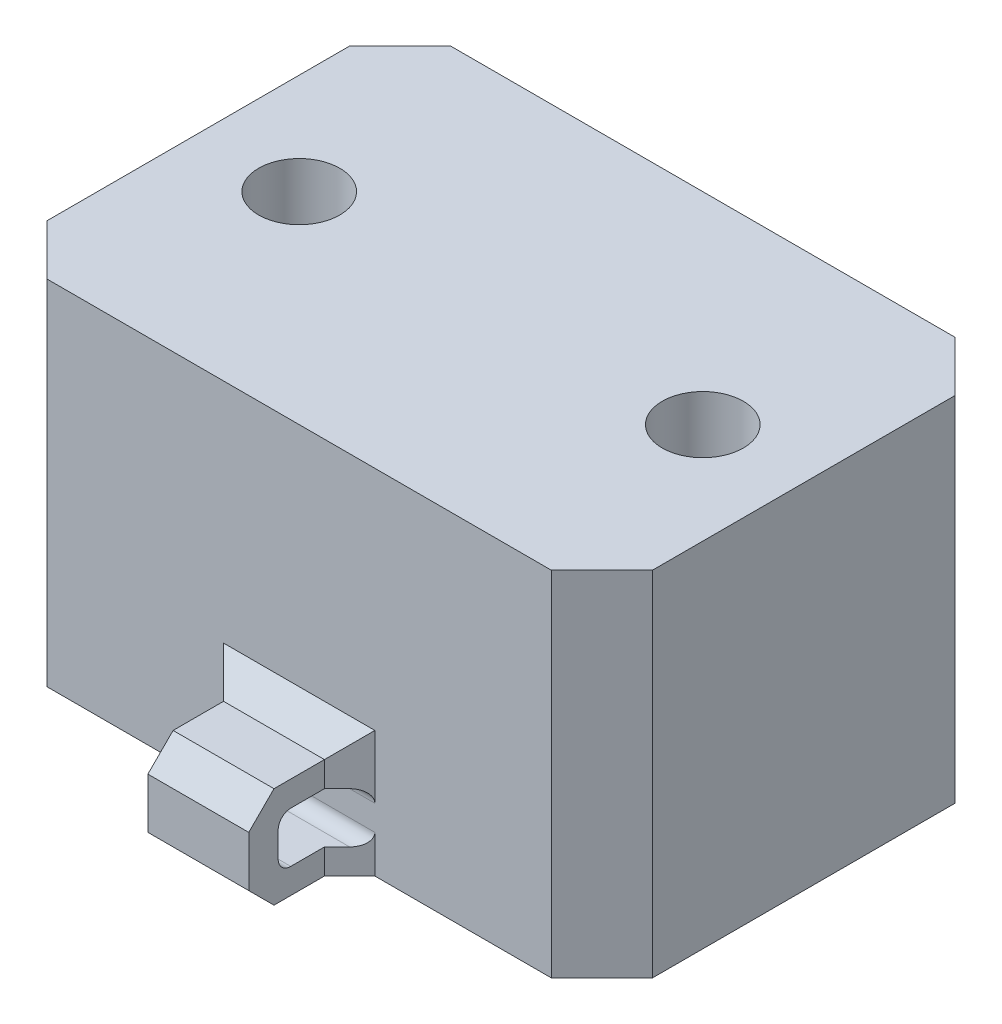
ISO-10303-21;
HEADER;
FILE_DESCRIPTION(('STEP AP214'),'2;1');
FILE_NAME('part.step','',(''),(''),'','','');
FILE_SCHEMA(('AUTOMOTIVE_DESIGN { 1 0 10303 214 1 1 1 1 }'));
ENDSEC;
DATA;
#1=APPLICATION_CONTEXT('core data for automotive mechanical design processes');
#2=APPLICATION_PROTOCOL_DEFINITION('international standard','automotive_design',2000,#1);
#3=PRODUCT_CONTEXT('',#1,'mechanical');
#4=PRODUCT('Part','Part','',(#3));
#5=PRODUCT_RELATED_PRODUCT_CATEGORY('part','',(#4));
#6=PRODUCT_DEFINITION_FORMATION('','',#4);
#7=PRODUCT_DEFINITION_CONTEXT('part definition',#1,'design');
#8=PRODUCT_DEFINITION('design','',#6,#7);
#9=PRODUCT_DEFINITION_SHAPE('','',#8);
#10=(LENGTH_UNIT() NAMED_UNIT(*) SI_UNIT(.MILLI.,.METRE.));
#11=(NAMED_UNIT(*) PLANE_ANGLE_UNIT() SI_UNIT($,.RADIAN.));
#12=(NAMED_UNIT(*) SI_UNIT($,.STERADIAN.) SOLID_ANGLE_UNIT());
#13=UNCERTAINTY_MEASURE_WITH_UNIT(LENGTH_MEASURE(1.E-05),#10,'distance_accuracy_value','');
#14=(GEOMETRIC_REPRESENTATION_CONTEXT(3) GLOBAL_UNCERTAINTY_ASSIGNED_CONTEXT((#13)) GLOBAL_UNIT_ASSIGNED_CONTEXT((#10,
#11,#12)) REPRESENTATION_CONTEXT('',''));
#15=CARTESIAN_POINT('',(0.,0.,0.));
#16=DIRECTION('',(0.,0.,1.));
#17=DIRECTION('',(1.,0.,0.));
#18=AXIS2_PLACEMENT_3D('',#15,#16,#17);
#19=CARTESIAN_POINT('',(-19.05,22.225,12.7));
#20=DIRECTION('',(0.,0.,-1.));
#21=DIRECTION('',(-1.,0.,0.));
#22=AXIS2_PLACEMENT_3D('',#19,#20,#21);
#23=PLANE('',#22);
#24=DIRECTION('',(0.,1.,0.));
#25=VECTOR('',#24,1.);
#26=CARTESIAN_POINT('',(-4.7625,1.5875,12.7));
#27=LINE('',#26,#25);
#28=CARTESIAN_POINT('',(-4.7625,0.,12.7));
#29=VERTEX_POINT('',#28);
#30=CARTESIAN_POINT('',(-4.7625,2.38125,12.7));
#31=VERTEX_POINT('',#30);
#32=EDGE_CURVE('E306',#29,#31,#27,.T.);
#33=ORIENTED_EDGE('',*,*,#32,.T.);
#34=DIRECTION('',(-1.,0.,0.));
#35=VECTOR('',#34,1.);
#36=CARTESIAN_POINT('',(4.7625,2.38125,12.7));
#37=LINE('',#36,#35);
#38=CARTESIAN_POINT('',(4.7625,2.38125,12.7));
#39=VERTEX_POINT('',#38);
#40=EDGE_CURVE('E346',#31,#39,#37,.F.);
#41=ORIENTED_EDGE('',*,*,#40,.T.);
#42=DIRECTION('',(0.,-1.,0.));
#43=VECTOR('',#42,1.);
#44=CARTESIAN_POINT('',(4.7625,0.,12.7));
#45=LINE('',#44,#43);
#46=CARTESIAN_POINT('',(4.7625,0.,12.7));
#47=VERTEX_POINT('',#46);
#48=EDGE_CURVE('E308',#39,#47,#45,.T.);
#49=ORIENTED_EDGE('',*,*,#48,.T.);
#50=DIRECTION('',(1.,0.,0.));
#51=VECTOR('',#50,1.);
#52=CARTESIAN_POINT('',(-19.05,0.,12.7));
#53=LINE('',#52,#51);
#54=CARTESIAN_POINT('',(15.875,0.,12.7));
#55=VERTEX_POINT('',#54);
#56=EDGE_CURVE('E237',#47,#55,#53,.T.);
#57=ORIENTED_EDGE('',*,*,#56,.T.);
#58=DIRECTION('',(0.,1.,0.));
#59=VECTOR('',#58,1.);
#60=CARTESIAN_POINT('',(15.875,22.225,12.7));
#61=LINE('',#60,#59);
#62=CARTESIAN_POINT('',(15.875,22.225,12.7));
#63=VERTEX_POINT('',#62);
#64=EDGE_CURVE('E266',#55,#63,#61,.T.);
#65=ORIENTED_EDGE('',*,*,#64,.T.);
#66=DIRECTION('',(1.,0.,0.));
#67=VECTOR('',#66,1.);
#68=CARTESIAN_POINT('',(-19.05,22.225,12.7));
#69=LINE('',#68,#67);
#70=CARTESIAN_POINT('',(-15.875,22.225,12.7));
#71=VERTEX_POINT('',#70);
#72=EDGE_CURVE('E248',#71,#63,#69,.T.);
#73=ORIENTED_EDGE('',*,*,#72,.F.);
#74=DIRECTION('',(0.,-1.,0.));
#75=VECTOR('',#74,1.);
#76=CARTESIAN_POINT('',(-15.875,22.225,12.7));
#77=LINE('',#76,#75);
#78=CARTESIAN_POINT('',(-15.875,0.,12.7));
#79=VERTEX_POINT('',#78);
#80=EDGE_CURVE('E268',#71,#79,#77,.T.);
#81=ORIENTED_EDGE('',*,*,#80,.T.);
#82=EDGE_CURVE('E240',#79,#29,#53,.T.);
#83=ORIENTED_EDGE('',*,*,#82,.T.);
#84=EDGE_LOOP('',(#33,#41,#49,#57,#65,#73,#81,#83));
#85=FACE_BOUND('',#84,.T.);
#86=DIRECTION('',(-1.,0.,0.));
#87=VECTOR('',#86,1.);
#88=CARTESIAN_POINT('',(-4.76249999999999,3.96875,12.7));
#89=LINE('',#88,#87);
#90=CARTESIAN_POINT('',(4.76249999999999,3.96875,12.7));
#91=VERTEX_POINT('',#90);
#92=CARTESIAN_POINT('',(-4.76249999999999,3.96875,12.7));
#93=VERTEX_POINT('',#92);
#94=EDGE_CURVE('E343',#91,#93,#89,.T.);
#95=ORIENTED_EDGE('',*,*,#94,.T.);
#96=DIRECTION('',(0.,1.,0.));
#97=VECTOR('',#96,1.);
#98=CARTESIAN_POINT('',(-4.76249999999999,6.35,12.7));
#99=LINE('',#98,#97);
#100=CARTESIAN_POINT('',(-4.76249999999999,7.93749999999999,12.7));
#101=VERTEX_POINT('',#100);
#102=EDGE_CURVE('E300',#93,#101,#99,.T.);
#103=ORIENTED_EDGE('',*,*,#102,.T.);
#104=DIRECTION('',(1.,0.,0.));
#105=VECTOR('',#104,1.);
#106=CARTESIAN_POINT('',(3.175,7.93749999999999,12.7));
#107=LINE('',#106,#105);
#108=CARTESIAN_POINT('',(4.76249999999999,7.93749999999999,12.7));
#109=VERTEX_POINT('',#108);
#110=EDGE_CURVE('E302',#101,#109,#107,.T.);
#111=ORIENTED_EDGE('',*,*,#110,.T.);
#112=DIRECTION('',(0.,-1.,0.));
#113=VECTOR('',#112,1.);
#114=CARTESIAN_POINT('',(4.76249999999999,4.7625,12.7));
#115=LINE('',#114,#113);
#116=EDGE_CURVE('E304',#109,#91,#115,.T.);
#117=ORIENTED_EDGE('',*,*,#116,.T.);
#118=EDGE_LOOP('',(#95,#103,#111,#117));
#119=FACE_BOUND('',#118,.T.);
#120=ADVANCED_FACE('F37',(#85,#119),#23,.F.);
#121=CARTESIAN_POINT('',(19.05,22.225,-12.7));
#122=DIRECTION('',(-1.,0.,0.));
#123=DIRECTION('',(0.,0.,1.));
#124=AXIS2_PLACEMENT_3D('',#121,#122,#123);
#125=PLANE('',#124);
#126=DIRECTION('',(0.,0.,-1.));
#127=VECTOR('',#126,1.);
#128=CARTESIAN_POINT('',(19.05,0.,-12.7));
#129=LINE('',#128,#127);
#130=CARTESIAN_POINT('',(19.05,0.,9.52500000000002));
#131=VERTEX_POINT('',#130);
#132=CARTESIAN_POINT('',(19.05,0.,-9.52499999999998));
#133=VERTEX_POINT('',#132);
#134=EDGE_CURVE('E242',#131,#133,#129,.T.);
#135=ORIENTED_EDGE('',*,*,#134,.T.);
#136=DIRECTION('',(0.,1.,0.));
#137=VECTOR('',#136,1.);
#138=CARTESIAN_POINT('',(19.05,22.225,-9.52499999999998));
#139=LINE('',#138,#137);
#140=CARTESIAN_POINT('',(19.05,22.225,-9.52499999999998));
#141=VERTEX_POINT('',#140);
#142=EDGE_CURVE('E274',#133,#141,#139,.T.);
#143=ORIENTED_EDGE('',*,*,#142,.T.);
#144=DIRECTION('',(0.,0.,-1.));
#145=VECTOR('',#144,1.);
#146=CARTESIAN_POINT('',(19.05,22.225,-12.7));
#147=LINE('',#146,#145);
#148=CARTESIAN_POINT('',(19.05,22.225,9.52500000000002));
#149=VERTEX_POINT('',#148);
#150=EDGE_CURVE('E247',#149,#141,#147,.T.);
#151=ORIENTED_EDGE('',*,*,#150,.F.);
#152=DIRECTION('',(0.,-1.,0.));
#153=VECTOR('',#152,1.);
#154=CARTESIAN_POINT('',(19.05,22.225,9.52500000000002));
#155=LINE('',#154,#153);
#156=EDGE_CURVE('E271',#149,#131,#155,.T.);
#157=ORIENTED_EDGE('',*,*,#156,.T.);
#158=EDGE_LOOP('',(#135,#143,#151,#157));
#159=FACE_BOUND('',#158,.T.);
#160=ADVANCED_FACE('F395',(#159),#125,.F.);
#161=CARTESIAN_POINT('',(-19.05,22.225,-12.7));
#162=DIRECTION('',(0.,0.,1.));
#163=DIRECTION('',(1.,0.,0.));
#164=AXIS2_PLACEMENT_3D('',#161,#162,#163);
#165=PLANE('',#164);
#166=DIRECTION('',(-1.,0.,0.));
#167=VECTOR('',#166,1.);
#168=CARTESIAN_POINT('',(-19.05,0.,-12.7));
#169=LINE('',#168,#167);
#170=CARTESIAN_POINT('',(15.875,0.,-12.7));
#171=VERTEX_POINT('',#170);
#172=CARTESIAN_POINT('',(-15.875,0.,-12.7));
#173=VERTEX_POINT('',#172);
#174=EDGE_CURVE('E238',#171,#173,#169,.T.);
#175=ORIENTED_EDGE('',*,*,#174,.T.);
#176=DIRECTION('',(0.,1.,0.));
#177=VECTOR('',#176,1.);
#178=CARTESIAN_POINT('',(-15.875,22.225,-12.7));
#179=LINE('',#178,#177);
#180=CARTESIAN_POINT('',(-15.875,22.225,-12.7));
#181=VERTEX_POINT('',#180);
#182=EDGE_CURVE('E215',#173,#181,#179,.T.);
#183=ORIENTED_EDGE('',*,*,#182,.T.);
#184=DIRECTION('',(-1.,0.,0.));
#185=VECTOR('',#184,1.);
#186=CARTESIAN_POINT('',(-19.05,22.225,-12.7));
#187=LINE('',#186,#185);
#188=CARTESIAN_POINT('',(15.875,22.225,-12.7));
#189=VERTEX_POINT('',#188);
#190=EDGE_CURVE('E515',#189,#181,#187,.T.);
#191=ORIENTED_EDGE('',*,*,#190,.F.);
#192=DIRECTION('',(0.,-1.,0.));
#193=VECTOR('',#192,1.);
#194=CARTESIAN_POINT('',(15.875,22.225,-12.7));
#195=LINE('',#194,#193);
#196=EDGE_CURVE('E220',#189,#171,#195,.T.);
#197=ORIENTED_EDGE('',*,*,#196,.T.);
#198=EDGE_LOOP('',(#175,#183,#191,#197));
#199=FACE_BOUND('',#198,.T.);
#200=ADVANCED_FACE('F401',(#199),#165,.F.);
#201=CARTESIAN_POINT('',(-19.05,22.225,-12.7));
#202=DIRECTION('',(1.,0.,0.));
#203=DIRECTION('',(0.,0.,-1.));
#204=AXIS2_PLACEMENT_3D('',#201,#202,#203);
#205=PLANE('',#204);
#206=DIRECTION('',(0.,0.,1.));
#207=VECTOR('',#206,1.);
#208=CARTESIAN_POINT('',(-19.05,22.225,-12.7));
#209=LINE('',#208,#207);
#210=CARTESIAN_POINT('',(-19.05,22.225,-9.52499999999999));
#211=VERTEX_POINT('',#210);
#212=CARTESIAN_POINT('',(-19.05,22.225,9.52499999999998));
#213=VERTEX_POINT('',#212);
#214=EDGE_CURVE('E230',#211,#213,#209,.T.);
#215=ORIENTED_EDGE('',*,*,#214,.F.);
#216=DIRECTION('',(0.,-1.,0.));
#217=VECTOR('',#216,1.);
#218=CARTESIAN_POINT('',(-19.05,22.225,-9.52499999999999));
#219=LINE('',#218,#217);
#220=CARTESIAN_POINT('',(-19.05,0.,-9.52499999999999));
#221=VERTEX_POINT('',#220);
#222=EDGE_CURVE('E214',#211,#221,#219,.T.);
#223=ORIENTED_EDGE('',*,*,#222,.T.);
#224=DIRECTION('',(0.,0.,1.));
#225=VECTOR('',#224,1.);
#226=CARTESIAN_POINT('',(-19.05,0.,-12.7));
#227=LINE('',#226,#225);
#228=CARTESIAN_POINT('',(-19.05,0.,9.52499999999998));
#229=VERTEX_POINT('',#228);
#230=EDGE_CURVE('E227',#221,#229,#227,.T.);
#231=ORIENTED_EDGE('',*,*,#230,.T.);
#232=DIRECTION('',(0.,1.,0.));
#233=VECTOR('',#232,1.);
#234=CARTESIAN_POINT('',(-19.05,22.225,9.52499999999998));
#235=LINE('',#234,#233);
#236=EDGE_CURVE('E232',#229,#213,#235,.T.);
#237=ORIENTED_EDGE('',*,*,#236,.T.);
#238=EDGE_LOOP('',(#215,#223,#231,#237));
#239=FACE_BOUND('',#238,.T.);
#240=ADVANCED_FACE('F226',(#239),#205,.F.);
#241=CARTESIAN_POINT('',(0.,22.225,0.));
#242=DIRECTION('',(0.,1.,0.));
#243=DIRECTION('',(0.,0.,1.));
#244=AXIS2_PLACEMENT_3D('',#241,#242,#243);
#245=PLANE('',#244);
#246=CARTESIAN_POINT('',(-12.7,22.225,2.07299455379228E-13));
#247=DIRECTION('',(0.,1.,0.));
#248=DIRECTION('',(0.,0.,1.));
#249=AXIS2_PLACEMENT_3D('',#246,#247,#248);
#250=CIRCLE('',#249,2.5527);
#251=CARTESIAN_POINT('',(-12.7,22.225,2.5527000000002));
#252=VERTEX_POINT('',#251);
#253=EDGE_CURVE('E501',#252,#252,#250,.T.);
#254=ORIENTED_EDGE('',*,*,#253,.F.);
#255=EDGE_LOOP('',(#254));
#256=FACE_BOUND('',#255,.T.);
#257=CARTESIAN_POINT('',(12.7,22.225,2.03830008427275E-13));
#258=DIRECTION('',(0.,1.,0.));
#259=DIRECTION('',(0.,0.,1.));
#260=AXIS2_PLACEMENT_3D('',#257,#258,#259);
#261=CIRCLE('',#260,2.5527);
#262=CARTESIAN_POINT('',(12.7,22.225,2.5527000000002));
#263=VERTEX_POINT('',#262);
#264=EDGE_CURVE('E507',#263,#263,#261,.T.);
#265=ORIENTED_EDGE('',*,*,#264,.F.);
#266=EDGE_LOOP('',(#265));
#267=FACE_BOUND('',#266,.T.);
#268=ORIENTED_EDGE('',*,*,#190,.T.);
#269=DIRECTION('',(0.707106781186549,0.,-0.707106781186546));
#270=VECTOR('',#269,1.);
#271=CARTESIAN_POINT('',(-14.2875,22.225,-14.2875));
#272=LINE('',#271,#270);
#273=EDGE_CURVE('E264',#181,#211,#272,.F.);
#274=ORIENTED_EDGE('',*,*,#273,.T.);
#275=ORIENTED_EDGE('',*,*,#214,.T.);
#276=DIRECTION('',(-0.707106781186546,0.,-0.707106781186549));
#277=VECTOR('',#276,1.);
#278=CARTESIAN_POINT('',(-14.2875,22.225,14.2875));
#279=LINE('',#278,#277);
#280=EDGE_CURVE('E262',#213,#71,#279,.F.);
#281=ORIENTED_EDGE('',*,*,#280,.T.);
#282=ORIENTED_EDGE('',*,*,#72,.T.);
#283=DIRECTION('',(-0.707106781186548,0.,0.707106781186547));
#284=VECTOR('',#283,1.);
#285=CARTESIAN_POINT('',(14.2875,22.225,14.2875));
#286=LINE('',#285,#284);
#287=EDGE_CURVE('E258',#63,#149,#286,.F.);
#288=ORIENTED_EDGE('',*,*,#287,.T.);
#289=ORIENTED_EDGE('',*,*,#150,.T.);
#290=DIRECTION('',(0.707106781186546,0.,0.707106781186549));
#291=VECTOR('',#290,1.);
#292=CARTESIAN_POINT('',(14.2875,22.225,-14.2875));
#293=LINE('',#292,#291);
#294=EDGE_CURVE('E260',#141,#189,#293,.F.);
#295=ORIENTED_EDGE('',*,*,#294,.T.);
#296=EDGE_LOOP('',(#268,#274,#275,#281,#282,#288,#289,#295));
#297=FACE_BOUND('',#296,.T.);
#298=ADVANCED_FACE('F410',(#256,#267,#297),#245,.T.);
#299=CARTESIAN_POINT('',(0.,0.,0.));
#300=DIRECTION('',(0.,1.,0.));
#301=DIRECTION('',(0.,0.,1.));
#302=AXIS2_PLACEMENT_3D('',#299,#300,#301);
#303=PLANE('',#302);
#304=CARTESIAN_POINT('',(-12.7,0.,2.07299455379228E-13));
#305=DIRECTION('',(0.,1.,0.));
#306=DIRECTION('',(0.,0.,1.));
#307=AXIS2_PLACEMENT_3D('',#304,#305,#306);
#308=CIRCLE('',#307,2.55269999999999);
#309=CARTESIAN_POINT('',(-12.7,0.,2.5527000000002));
#310=VERTEX_POINT('',#309);
#311=EDGE_CURVE('E504',#310,#310,#308,.T.);
#312=ORIENTED_EDGE('',*,*,#311,.T.);
#313=EDGE_LOOP('',(#312));
#314=FACE_BOUND('',#313,.T.);
#315=CARTESIAN_POINT('',(12.7,0.,2.03830008427275E-13));
#316=DIRECTION('',(0.,1.,0.));
#317=DIRECTION('',(0.,0.,1.));
#318=AXIS2_PLACEMENT_3D('',#315,#316,#317);
#319=CIRCLE('',#318,2.55269999999999);
#320=CARTESIAN_POINT('',(12.7,0.,2.5527000000002));
#321=VERTEX_POINT('',#320);
#322=EDGE_CURVE('E510',#321,#321,#319,.T.);
#323=ORIENTED_EDGE('',*,*,#322,.T.);
#324=EDGE_LOOP('',(#323));
#325=FACE_BOUND('',#324,.T.);
#326=DIRECTION('',(0.,0.,-1.));
#327=VECTOR('',#326,1.);
#328=CARTESIAN_POINT('',(3.175,0.,19.05));
#329=LINE('',#328,#327);
#330=CARTESIAN_POINT('',(3.175,0.,17.4625));
#331=VERTEX_POINT('',#330);
#332=CARTESIAN_POINT('',(3.175,0.,14.2875));
#333=VERTEX_POINT('',#332);
#334=EDGE_CURVE('E496',#331,#333,#329,.T.);
#335=ORIENTED_EDGE('',*,*,#334,.F.);
#336=DIRECTION('',(-1.,0.,0.));
#337=VECTOR('',#336,1.);
#338=CARTESIAN_POINT('',(-3.175,0.,17.4625));
#339=LINE('',#338,#337);
#340=CARTESIAN_POINT('',(-3.175,0.,17.4625));
#341=VERTEX_POINT('',#340);
#342=EDGE_CURVE('E292',#331,#341,#339,.T.);
#343=ORIENTED_EDGE('',*,*,#342,.T.);
#344=DIRECTION('',(0.,0.,-1.));
#345=VECTOR('',#344,1.);
#346=CARTESIAN_POINT('',(-3.175,0.,19.05));
#347=LINE('',#346,#345);
#348=CARTESIAN_POINT('',(-3.175,0.,14.2875));
#349=VERTEX_POINT('',#348);
#350=EDGE_CURVE('E498',#341,#349,#347,.T.);
#351=ORIENTED_EDGE('',*,*,#350,.T.);
#352=DIRECTION('',(0.707106781186544,0.,0.707106781186551));
#353=VECTOR('',#352,1.);
#354=CARTESIAN_POINT('',(-8.73125000000002,0.,8.73124999999994));
#355=LINE('',#354,#353);
#356=EDGE_CURVE('E323',#349,#29,#355,.F.);
#357=ORIENTED_EDGE('',*,*,#356,.T.);
#358=ORIENTED_EDGE('',*,*,#82,.F.);
#359=DIRECTION('',(0.707106781186546,0.,0.707106781186549));
#360=VECTOR('',#359,1.);
#361=CARTESIAN_POINT('',(-15.875,0.,12.7));
#362=LINE('',#361,#360);
#363=EDGE_CURVE('E221',#79,#229,#362,.F.);
#364=ORIENTED_EDGE('',*,*,#363,.T.);
#365=ORIENTED_EDGE('',*,*,#230,.F.);
#366=DIRECTION('',(-0.707106781186549,0.,0.707106781186546));
#367=VECTOR('',#366,1.);
#368=CARTESIAN_POINT('',(-19.05,0.,-9.52499999999999));
#369=LINE('',#368,#367);
#370=EDGE_CURVE('E210',#221,#173,#369,.F.);
#371=ORIENTED_EDGE('',*,*,#370,.T.);
#372=ORIENTED_EDGE('',*,*,#174,.F.);
#373=DIRECTION('',(-0.707106781186546,0.,-0.707106781186549));
#374=VECTOR('',#373,1.);
#375=CARTESIAN_POINT('',(15.875,0.,-12.7));
#376=LINE('',#375,#374);
#377=EDGE_CURVE('E252',#171,#133,#376,.F.);
#378=ORIENTED_EDGE('',*,*,#377,.T.);
#379=ORIENTED_EDGE('',*,*,#134,.F.);
#380=DIRECTION('',(0.707106781186548,0.,-0.707106781186547));
#381=VECTOR('',#380,1.);
#382=CARTESIAN_POINT('',(19.05,0.,9.52500000000002));
#383=LINE('',#382,#381);
#384=EDGE_CURVE('E231',#131,#55,#383,.F.);
#385=ORIENTED_EDGE('',*,*,#384,.T.);
#386=ORIENTED_EDGE('',*,*,#56,.F.);
#387=DIRECTION('',(0.707106781186544,0.,-0.707106781186551));
#388=VECTOR('',#387,1.);
#389=CARTESIAN_POINT('',(8.73125000000002,0.,8.73124999999994));
#390=LINE('',#389,#388);
#391=EDGE_CURVE('E321',#47,#333,#390,.F.);
#392=ORIENTED_EDGE('',*,*,#391,.T.);
#393=EDGE_LOOP('',(#335,#343,#351,#357,#358,#364,#365,#371,#372,#378,#379,#385,#386,#392));
#394=FACE_BOUND('',#393,.T.);
#395=ADVANCED_FACE('F235',(#314,#325,#394),#303,.F.);
#396=CARTESIAN_POINT('',(12.7,22.225,2.03830008427275E-13));
#397=DIRECTION('',(0.,1.,0.));
#398=DIRECTION('',(0.,0.,1.));
#399=AXIS2_PLACEMENT_3D('',#396,#397,#398);
#400=CYLINDRICAL_SURFACE('',#399,2.5527);
#401=ORIENTED_EDGE('',*,*,#322,.F.);
#402=EDGE_LOOP('',(#401));
#403=FACE_BOUND('',#402,.T.);
#404=ORIENTED_EDGE('',*,*,#264,.T.);
#405=EDGE_LOOP('',(#404));
#406=FACE_BOUND('',#405,.T.);
#407=ADVANCED_FACE('F583',(#403,#406),#400,.F.);
#408=CARTESIAN_POINT('',(-12.7,22.225,2.07299455379228E-13));
#409=DIRECTION('',(0.,1.,0.));
#410=DIRECTION('',(0.,0.,1.));
#411=AXIS2_PLACEMENT_3D('',#408,#409,#410);
#412=CYLINDRICAL_SURFACE('',#411,2.5527);
#413=ORIENTED_EDGE('',*,*,#311,.F.);
#414=EDGE_LOOP('',(#413));
#415=FACE_BOUND('',#414,.T.);
#416=ORIENTED_EDGE('',*,*,#253,.T.);
#417=EDGE_LOOP('',(#416));
#418=FACE_BOUND('',#417,.T.);
#419=ADVANCED_FACE('F417',(#415,#418),#412,.F.);
#420=CARTESIAN_POINT('',(-19.05,22.225,-9.52499999999999));
#421=DIRECTION('',(0.707106781186546,0.,0.707106781186549));
#422=DIRECTION('',(0.,-1.,0.));
#423=AXIS2_PLACEMENT_3D('',#420,#421,#422);
#424=PLANE('',#423);
#425=ORIENTED_EDGE('',*,*,#273,.F.);
#426=ORIENTED_EDGE('',*,*,#182,.F.);
#427=ORIENTED_EDGE('',*,*,#370,.F.);
#428=ORIENTED_EDGE('',*,*,#222,.F.);
#429=EDGE_LOOP('',(#425,#426,#427,#428));
#430=FACE_BOUND('',#429,.T.);
#431=ADVANCED_FACE('F213',(#430),#424,.F.);
#432=CARTESIAN_POINT('',(-15.875,22.225,12.7));
#433=DIRECTION('',(0.707106781186549,0.,-0.707106781186546));
#434=DIRECTION('',(0.,-1.,0.));
#435=AXIS2_PLACEMENT_3D('',#432,#433,#434);
#436=PLANE('',#435);
#437=ORIENTED_EDGE('',*,*,#280,.F.);
#438=ORIENTED_EDGE('',*,*,#236,.F.);
#439=ORIENTED_EDGE('',*,*,#363,.F.);
#440=ORIENTED_EDGE('',*,*,#80,.F.);
#441=EDGE_LOOP('',(#437,#438,#439,#440));
#442=FACE_BOUND('',#441,.T.);
#443=ADVANCED_FACE('F416',(#442),#436,.F.);
#444=CARTESIAN_POINT('',(15.875,22.225,-12.7));
#445=DIRECTION('',(-0.707106781186549,0.,0.707106781186546));
#446=DIRECTION('',(0.,-1.,0.));
#447=AXIS2_PLACEMENT_3D('',#444,#445,#446);
#448=PLANE('',#447);
#449=ORIENTED_EDGE('',*,*,#294,.F.);
#450=ORIENTED_EDGE('',*,*,#142,.F.);
#451=ORIENTED_EDGE('',*,*,#377,.F.);
#452=ORIENTED_EDGE('',*,*,#196,.F.);
#453=EDGE_LOOP('',(#449,#450,#451,#452));
#454=FACE_BOUND('',#453,.T.);
#455=ADVANCED_FACE('F420',(#454),#448,.F.);
#456=CARTESIAN_POINT('',(19.05,22.225,9.52500000000002));
#457=DIRECTION('',(-0.707106781186547,0.,-0.707106781186548));
#458=DIRECTION('',(0.,-1.,0.));
#459=AXIS2_PLACEMENT_3D('',#456,#457,#458);
#460=PLANE('',#459);
#461=ORIENTED_EDGE('',*,*,#287,.F.);
#462=ORIENTED_EDGE('',*,*,#64,.F.);
#463=ORIENTED_EDGE('',*,*,#384,.F.);
#464=ORIENTED_EDGE('',*,*,#156,.F.);
#465=EDGE_LOOP('',(#461,#462,#463,#464));
#466=FACE_BOUND('',#465,.T.);
#467=ADVANCED_FACE('F424',(#466),#460,.F.);
#468=CARTESIAN_POINT('',(-3.175,6.35,19.05));
#469=DIRECTION('',(1.,0.,0.));
#470=DIRECTION('',(0.,1.,0.));
#471=AXIS2_PLACEMENT_3D('',#468,#469,#470);
#472=PLANE('',#471);
#473=DIRECTION('',(0.,0.,1.));
#474=VECTOR('',#473,1.);
#475=CARTESIAN_POINT('',(-3.175,1.5875,17.2));
#476=LINE('',#475,#474);
#477=CARTESIAN_POINT('',(-3.175,1.5875,14.2875));
#478=VERTEX_POINT('',#477);
#479=CARTESIAN_POINT('',(-3.175,1.5875,16.40625));
#480=VERTEX_POINT('',#479);
#481=EDGE_CURVE('E479',#478,#480,#476,.T.);
#482=ORIENTED_EDGE('',*,*,#481,.F.);
#483=DIRECTION('',(0.,-1.,0.));
#484=VECTOR('',#483,1.);
#485=CARTESIAN_POINT('',(-3.175,0.,14.2875));
#486=LINE('',#485,#484);
#487=EDGE_CURVE('E313',#478,#349,#486,.T.);
#488=ORIENTED_EDGE('',*,*,#487,.T.);
#489=ORIENTED_EDGE('',*,*,#350,.F.);
#490=DIRECTION('',(0.,0.707106781186546,0.707106781186549));
#491=VECTOR('',#490,1.);
#492=CARTESIAN_POINT('',(-3.175,1.5875,19.05));
#493=LINE('',#492,#491);
#494=CARTESIAN_POINT('',(-3.175,1.5875,19.05));
#495=VERTEX_POINT('',#494);
#496=EDGE_CURVE('E282',#341,#495,#493,.T.);
#497=ORIENTED_EDGE('',*,*,#496,.T.);
#498=DIRECTION('',(0.,-1.,0.));
#499=VECTOR('',#498,1.);
#500=CARTESIAN_POINT('',(-3.175,6.35,19.05));
#501=LINE('',#500,#499);
#502=CARTESIAN_POINT('',(-3.175,4.7625,19.05));
#503=VERTEX_POINT('',#502);
#504=EDGE_CURVE('E484',#503,#495,#501,.T.);
#505=ORIENTED_EDGE('',*,*,#504,.F.);
#506=DIRECTION('',(0.,0.707106781186546,-0.707106781186549));
#507=VECTOR('',#506,1.);
#508=CARTESIAN_POINT('',(-3.175,4.7625,19.05));
#509=LINE('',#508,#507);
#510=CARTESIAN_POINT('',(-3.175,6.35,17.4625));
#511=VERTEX_POINT('',#510);
#512=EDGE_CURVE('E284',#503,#511,#509,.T.);
#513=ORIENTED_EDGE('',*,*,#512,.T.);
#514=DIRECTION('',(0.,0.,-1.));
#515=VECTOR('',#514,1.);
#516=CARTESIAN_POINT('',(-3.175,6.35,19.05));
#517=LINE('',#516,#515);
#518=CARTESIAN_POINT('',(-3.175,6.35,14.2875));
#519=VERTEX_POINT('',#518);
#520=EDGE_CURVE('E490',#511,#519,#517,.T.);
#521=ORIENTED_EDGE('',*,*,#520,.T.);
#522=DIRECTION('',(0.,-1.,0.));
#523=VECTOR('',#522,1.);
#524=CARTESIAN_POINT('',(-3.175,4.7625,14.2875));
#525=LINE('',#524,#523);
#526=CARTESIAN_POINT('',(-3.175,4.7625,14.2875));
#527=VERTEX_POINT('',#526);
#528=EDGE_CURVE('E310',#519,#527,#525,.T.);
#529=ORIENTED_EDGE('',*,*,#528,.T.);
#530=DIRECTION('',(0.,0.,-1.));
#531=VECTOR('',#530,1.);
#532=CARTESIAN_POINT('',(-3.175,4.7625,17.2));
#533=LINE('',#532,#531);
#534=CARTESIAN_POINT('',(-3.175,4.7625,16.40625));
#535=VERTEX_POINT('',#534);
#536=EDGE_CURVE('E475',#535,#527,#533,.T.);
#537=ORIENTED_EDGE('',*,*,#536,.F.);
#538=CARTESIAN_POINT('',(-3.175,3.96875,16.40625));
#539=DIRECTION('',(1.,0.,0.));
#540=DIRECTION('',(0.,1.,0.));
#541=AXIS2_PLACEMENT_3D('',#538,#539,#540);
#542=CIRCLE('',#541,0.79375);
#543=CARTESIAN_POINT('',(-3.175,3.96875,17.2));
#544=VERTEX_POINT('',#543);
#545=EDGE_CURVE('E45',#535,#544,#542,.T.);
#546=ORIENTED_EDGE('',*,*,#545,.T.);
#547=DIRECTION('',(0.,1.,0.));
#548=VECTOR('',#547,1.);
#549=CARTESIAN_POINT('',(-3.175,4.7625,17.2));
#550=LINE('',#549,#548);
#551=CARTESIAN_POINT('',(-3.175,2.38125,17.2));
#552=VERTEX_POINT('',#551);
#553=EDGE_CURVE('E473',#552,#544,#550,.T.);
#554=ORIENTED_EDGE('',*,*,#553,.F.);
#555=CARTESIAN_POINT('',(-3.175,2.38125,16.40625));
#556=DIRECTION('',(1.,0.,0.));
#557=DIRECTION('',(0.,1.,0.));
#558=AXIS2_PLACEMENT_3D('',#555,#556,#557);
#559=CIRCLE('',#558,0.79375);
#560=EDGE_CURVE('E59',#552,#480,#559,.T.);
#561=ORIENTED_EDGE('',*,*,#560,.T.);
#562=EDGE_LOOP('',(#482,#488,#489,#497,#505,#513,#521,#529,#537,#546,#554,#561));
#563=FACE_BOUND('',#562,.T.);
#564=ADVANCED_FACE('F428',(#563),#472,.F.);
#565=CARTESIAN_POINT('',(3.175,6.35,19.05));
#566=DIRECTION('',(-1.,0.,0.));
#567=DIRECTION('',(0.,-1.,0.));
#568=AXIS2_PLACEMENT_3D('',#565,#566,#567);
#569=PLANE('',#568);
#570=ORIENTED_EDGE('',*,*,#334,.T.);
#571=DIRECTION('',(0.,1.,0.));
#572=VECTOR('',#571,1.);
#573=CARTESIAN_POINT('',(3.175,1.5875,14.2875));
#574=LINE('',#573,#572);
#575=CARTESIAN_POINT('',(3.175,1.5875,14.2875));
#576=VERTEX_POINT('',#575);
#577=EDGE_CURVE('E297',#333,#576,#574,.T.);
#578=ORIENTED_EDGE('',*,*,#577,.T.);
#579=DIRECTION('',(0.,0.,-1.));
#580=VECTOR('',#579,1.);
#581=CARTESIAN_POINT('',(3.175,1.5875,17.2));
#582=LINE('',#581,#580);
#583=CARTESIAN_POINT('',(3.175,1.5875,16.40625));
#584=VERTEX_POINT('',#583);
#585=EDGE_CURVE('E378',#584,#576,#582,.T.);
#586=ORIENTED_EDGE('',*,*,#585,.F.);
#587=CARTESIAN_POINT('',(3.175,2.38125,16.40625));
#588=DIRECTION('',(-1.,0.,0.));
#589=DIRECTION('',(0.,-1.,0.));
#590=AXIS2_PLACEMENT_3D('',#587,#588,#589);
#591=CIRCLE('',#590,0.79375);
#592=CARTESIAN_POINT('',(3.175,2.38125,17.2));
#593=VERTEX_POINT('',#592);
#594=EDGE_CURVE('E369',#584,#593,#591,.T.);
#595=ORIENTED_EDGE('',*,*,#594,.T.);
#596=DIRECTION('',(0.,-1.,0.));
#597=VECTOR('',#596,1.);
#598=CARTESIAN_POINT('',(3.175,4.7625,17.2));
#599=LINE('',#598,#597);
#600=CARTESIAN_POINT('',(3.175,3.96875,17.2));
#601=VERTEX_POINT('',#600);
#602=EDGE_CURVE('E338',#601,#593,#599,.T.);
#603=ORIENTED_EDGE('',*,*,#602,.F.);
#604=CARTESIAN_POINT('',(3.175,3.96875,16.40625));
#605=DIRECTION('',(-1.,0.,0.));
#606=DIRECTION('',(0.,-1.,0.));
#607=AXIS2_PLACEMENT_3D('',#604,#605,#606);
#608=CIRCLE('',#607,0.79375);
#609=CARTESIAN_POINT('',(3.175,4.7625,16.40625));
#610=VERTEX_POINT('',#609);
#611=EDGE_CURVE('E11',#601,#610,#608,.T.);
#612=ORIENTED_EDGE('',*,*,#611,.T.);
#613=DIRECTION('',(0.,0.,1.));
#614=VECTOR('',#613,1.);
#615=CARTESIAN_POINT('',(3.175,4.7625,17.2));
#616=LINE('',#615,#614);
#617=CARTESIAN_POINT('',(3.175,4.7625,14.2875));
#618=VERTEX_POINT('',#617);
#619=EDGE_CURVE('E481',#618,#610,#616,.T.);
#620=ORIENTED_EDGE('',*,*,#619,.F.);
#621=DIRECTION('',(0.,1.,0.));
#622=VECTOR('',#621,1.);
#623=CARTESIAN_POINT('',(3.175,6.35,14.2875));
#624=LINE('',#623,#622);
#625=CARTESIAN_POINT('',(3.175,6.35,14.2875));
#626=VERTEX_POINT('',#625);
#627=EDGE_CURVE('E294',#618,#626,#624,.T.);
#628=ORIENTED_EDGE('',*,*,#627,.T.);
#629=DIRECTION('',(0.,0.,-1.));
#630=VECTOR('',#629,1.);
#631=CARTESIAN_POINT('',(3.175,6.35,19.05));
#632=LINE('',#631,#630);
#633=CARTESIAN_POINT('',(3.175,6.35,17.4625));
#634=VERTEX_POINT('',#633);
#635=EDGE_CURVE('E493',#634,#626,#632,.T.);
#636=ORIENTED_EDGE('',*,*,#635,.F.);
#637=DIRECTION('',(0.,-0.707106781186546,0.707106781186549));
#638=VECTOR('',#637,1.);
#639=CARTESIAN_POINT('',(3.175,4.76249999999999,19.05));
#640=LINE('',#639,#638);
#641=CARTESIAN_POINT('',(3.175,4.76249999999999,19.05));
#642=VERTEX_POINT('',#641);
#643=EDGE_CURVE('E290',#634,#642,#640,.T.);
#644=ORIENTED_EDGE('',*,*,#643,.T.);
#645=DIRECTION('',(0.,1.,0.));
#646=VECTOR('',#645,1.);
#647=CARTESIAN_POINT('',(3.175,6.35,19.05));
#648=LINE('',#647,#646);
#649=CARTESIAN_POINT('',(3.175,1.5875,19.05));
#650=VERTEX_POINT('',#649);
#651=EDGE_CURVE('E487',#650,#642,#648,.T.);
#652=ORIENTED_EDGE('',*,*,#651,.F.);
#653=DIRECTION('',(0.,-0.707106781186546,-0.707106781186549));
#654=VECTOR('',#653,1.);
#655=CARTESIAN_POINT('',(3.175,1.5875,19.05));
#656=LINE('',#655,#654);
#657=EDGE_CURVE('E288',#650,#331,#656,.T.);
#658=ORIENTED_EDGE('',*,*,#657,.T.);
#659=EDGE_LOOP('',(#570,#578,#586,#595,#603,#612,#620,#628,#636,#644,#652,#658));
#660=FACE_BOUND('',#659,.T.);
#661=ADVANCED_FACE('F376',(#660),#569,.F.);
#662=CARTESIAN_POINT('',(-3.175,6.35,19.05));
#663=DIRECTION('',(0.,-1.,0.));
#664=DIRECTION('',(1.,0.,0.));
#665=AXIS2_PLACEMENT_3D('',#662,#663,#664);
#666=PLANE('',#665);
#667=ORIENTED_EDGE('',*,*,#635,.T.);
#668=DIRECTION('',(-1.,0.,0.));
#669=VECTOR('',#668,1.);
#670=CARTESIAN_POINT('',(-3.175,6.35,14.2875));
#671=LINE('',#670,#669);
#672=EDGE_CURVE('E316',#626,#519,#671,.T.);
#673=ORIENTED_EDGE('',*,*,#672,.T.);
#674=ORIENTED_EDGE('',*,*,#520,.F.);
#675=DIRECTION('',(1.,0.,0.));
#676=VECTOR('',#675,1.);
#677=CARTESIAN_POINT('',(3.175,6.35,17.4625));
#678=LINE('',#677,#676);
#679=EDGE_CURVE('E286',#511,#634,#678,.T.);
#680=ORIENTED_EDGE('',*,*,#679,.T.);
#681=EDGE_LOOP('',(#667,#673,#674,#680));
#682=FACE_BOUND('',#681,.T.);
#683=ADVANCED_FACE('F547',(#682),#666,.F.);
#684=CARTESIAN_POINT('',(0.,0.,19.05));
#685=DIRECTION('',(0.,0.,1.));
#686=DIRECTION('',(1.,0.,0.));
#687=AXIS2_PLACEMENT_3D('',#684,#685,#686);
#688=PLANE('',#687);
#689=ORIENTED_EDGE('',*,*,#651,.T.);
#690=DIRECTION('',(-1.,0.,0.));
#691=VECTOR('',#690,1.);
#692=CARTESIAN_POINT('',(-3.175,4.7625,19.05));
#693=LINE('',#692,#691);
#694=EDGE_CURVE('E279',#642,#503,#693,.T.);
#695=ORIENTED_EDGE('',*,*,#694,.T.);
#696=ORIENTED_EDGE('',*,*,#504,.T.);
#697=DIRECTION('',(1.,0.,0.));
#698=VECTOR('',#697,1.);
#699=CARTESIAN_POINT('',(3.175,1.5875,19.05));
#700=LINE('',#699,#698);
#701=EDGE_CURVE('E276',#495,#650,#700,.T.);
#702=ORIENTED_EDGE('',*,*,#701,.T.);
#703=EDGE_LOOP('',(#689,#695,#696,#702));
#704=FACE_BOUND('',#703,.T.);
#705=ADVANCED_FACE('F540',(#704),#688,.T.);
#706=CARTESIAN_POINT('',(19.051,4.7625,17.2));
#707=DIRECTION('',(0.,0.,1.));
#708=DIRECTION('',(1.,0.,0.));
#709=AXIS2_PLACEMENT_3D('',#706,#707,#708);
#710=PLANE('',#709);
#711=ORIENTED_EDGE('',*,*,#602,.T.);
#712=DIRECTION('',(-1.,0.,0.));
#713=VECTOR('',#712,1.);
#714=CARTESIAN_POINT('',(-3.175,2.38125,17.2));
#715=LINE('',#714,#713);
#716=EDGE_CURVE('E356',#593,#552,#715,.T.);
#717=ORIENTED_EDGE('',*,*,#716,.T.);
#718=ORIENTED_EDGE('',*,*,#553,.T.);
#719=DIRECTION('',(-1.,0.,0.));
#720=VECTOR('',#719,1.);
#721=CARTESIAN_POINT('',(3.175,3.96875,17.2));
#722=LINE('',#721,#720);
#723=EDGE_CURVE('E354',#544,#601,#722,.F.);
#724=ORIENTED_EDGE('',*,*,#723,.T.);
#725=EDGE_LOOP('',(#711,#717,#718,#724));
#726=FACE_BOUND('',#725,.T.);
#727=ADVANCED_FACE('F380',(#726),#710,.F.);
#728=CARTESIAN_POINT('',(19.051,1.5875,17.2));
#729=DIRECTION('',(0.,-1.,0.));
#730=DIRECTION('',(0.,0.,-1.));
#731=AXIS2_PLACEMENT_3D('',#728,#729,#730);
#732=PLANE('',#731);
#733=DIRECTION('',(-0.707106781186544,0.,0.707106781186551));
#734=VECTOR('',#733,1.);
#735=CARTESIAN_POINT('',(9.65674999999993,1.5875,7.80575000000002));
#736=LINE('',#735,#734);
#737=CARTESIAN_POINT('',(3.96875000000001,1.5875,13.49375));
#738=VERTEX_POINT('',#737);
#739=EDGE_CURVE('E318',#576,#738,#736,.F.);
#740=ORIENTED_EDGE('',*,*,#739,.T.);
#741=DIRECTION('',(-1.,0.,0.));
#742=VECTOR('',#741,1.);
#743=CARTESIAN_POINT('',(-4.7625,1.5875,13.49375));
#744=LINE('',#743,#742);
#745=CARTESIAN_POINT('',(-3.96875,1.5875,13.49375));
#746=VERTEX_POINT('',#745);
#747=EDGE_CURVE('E340',#738,#746,#744,.T.);
#748=ORIENTED_EDGE('',*,*,#747,.T.);
#749=DIRECTION('',(-0.707106781186544,0.,-0.707106781186551));
#750=VECTOR('',#749,1.);
#751=CARTESIAN_POINT('',(9.39424999999989,1.5875,26.85675));
#752=LINE('',#751,#750);
#753=EDGE_CURVE('E325',#746,#478,#752,.F.);
#754=ORIENTED_EDGE('',*,*,#753,.T.);
#755=ORIENTED_EDGE('',*,*,#481,.T.);
#756=DIRECTION('',(-1.,0.,0.));
#757=VECTOR('',#756,1.);
#758=CARTESIAN_POINT('',(3.175,1.5875,16.40625));
#759=LINE('',#758,#757);
#760=EDGE_CURVE('E332',#480,#584,#759,.F.);
#761=ORIENTED_EDGE('',*,*,#760,.T.);
#762=ORIENTED_EDGE('',*,*,#585,.T.);
#763=EDGE_LOOP('',(#740,#748,#754,#755,#761,#762));
#764=FACE_BOUND('',#763,.T.);
#765=ADVANCED_FACE('F470',(#764),#732,.F.);
#766=CARTESIAN_POINT('',(19.051,4.7625,17.2));
#767=DIRECTION('',(0.,1.,0.));
#768=DIRECTION('',(-1.,0.,0.));
#769=AXIS2_PLACEMENT_3D('',#766,#767,#768);
#770=PLANE('',#769);
#771=DIRECTION('',(0.707106781186544,0.,0.707106781186551));
#772=VECTOR('',#771,1.);
#773=CARTESIAN_POINT('',(9.3942499999999,4.7625,26.85675));
#774=LINE('',#773,#772);
#775=CARTESIAN_POINT('',(-3.96875,4.7625,13.49375));
#776=VERTEX_POINT('',#775);
#777=EDGE_CURVE('E329',#527,#776,#774,.F.);
#778=ORIENTED_EDGE('',*,*,#777,.T.);
#779=DIRECTION('',(-1.,0.,0.));
#780=VECTOR('',#779,1.);
#781=CARTESIAN_POINT('',(4.76249999999999,4.7625,13.49375));
#782=LINE('',#781,#780);
#783=CARTESIAN_POINT('',(3.96875,4.7625,13.49375));
#784=VERTEX_POINT('',#783);
#785=EDGE_CURVE('E352',#776,#784,#782,.F.);
#786=ORIENTED_EDGE('',*,*,#785,.T.);
#787=DIRECTION('',(0.707106781186545,0.,-0.70710678118655));
#788=VECTOR('',#787,1.);
#789=CARTESIAN_POINT('',(9.65674999999995,4.7625,7.80575000000002));
#790=LINE('',#789,#788);
#791=EDGE_CURVE('E327',#784,#618,#790,.F.);
#792=ORIENTED_EDGE('',*,*,#791,.T.);
#793=ORIENTED_EDGE('',*,*,#619,.T.);
#794=DIRECTION('',(-1.,0.,0.));
#795=VECTOR('',#794,1.);
#796=CARTESIAN_POINT('',(-3.175,4.7625,16.40625));
#797=LINE('',#796,#795);
#798=EDGE_CURVE('E349',#610,#535,#797,.T.);
#799=ORIENTED_EDGE('',*,*,#798,.T.);
#800=ORIENTED_EDGE('',*,*,#536,.T.);
#801=EDGE_LOOP('',(#778,#786,#792,#793,#799,#800));
#802=FACE_BOUND('',#801,.T.);
#803=ADVANCED_FACE('F434',(#802),#770,.F.);
#804=CARTESIAN_POINT('',(0.,4.76249999999999,19.05));
#805=DIRECTION('',(0.,0.707106781186549,0.707106781186546));
#806=DIRECTION('',(1.,0.,0.));
#807=AXIS2_PLACEMENT_3D('',#804,#805,#806);
#808=PLANE('',#807);
#809=ORIENTED_EDGE('',*,*,#643,.F.);
#810=ORIENTED_EDGE('',*,*,#679,.F.);
#811=ORIENTED_EDGE('',*,*,#512,.F.);
#812=ORIENTED_EDGE('',*,*,#694,.F.);
#813=EDGE_LOOP('',(#809,#810,#811,#812));
#814=FACE_BOUND('',#813,.T.);
#815=ADVANCED_FACE('F430',(#814),#808,.T.);
#816=CARTESIAN_POINT('',(0.,1.5875,19.05));
#817=DIRECTION('',(0.,-0.707106781186549,0.707106781186546));
#818=DIRECTION('',(-1.,0.,0.));
#819=AXIS2_PLACEMENT_3D('',#816,#817,#818);
#820=PLANE('',#819);
#821=ORIENTED_EDGE('',*,*,#496,.F.);
#822=ORIENTED_EDGE('',*,*,#342,.F.);
#823=ORIENTED_EDGE('',*,*,#657,.F.);
#824=ORIENTED_EDGE('',*,*,#701,.F.);
#825=EDGE_LOOP('',(#821,#822,#823,#824));
#826=FACE_BOUND('',#825,.T.);
#827=ADVANCED_FACE('F433',(#826),#820,.T.);
#828=CARTESIAN_POINT('',(3.175,6.35,14.2875));
#829=DIRECTION('',(0.707106781186551,0.,0.707106781186544));
#830=DIRECTION('',(0.,-1.,0.));
#831=AXIS2_PLACEMENT_3D('',#828,#829,#830);
#832=PLANE('',#831);
#833=ORIENTED_EDGE('',*,*,#391,.F.);
#834=ORIENTED_EDGE('',*,*,#48,.F.);
#835=CARTESIAN_POINT('',(3.96875000000001,2.38125,13.49375));
#836=DIRECTION('',(0.707106781186551,0.,0.707106781186544));
#837=DIRECTION('',(0.707106781186544,0.,-0.707106781186551));
#838=AXIS2_PLACEMENT_3D('',#835,#836,#837);
#839=ELLIPSE('',#838,1.12253201513364,0.79375);
#840=EDGE_CURVE('E361',#39,#738,#839,.F.);
#841=ORIENTED_EDGE('',*,*,#840,.T.);
#842=ORIENTED_EDGE('',*,*,#739,.F.);
#843=ORIENTED_EDGE('',*,*,#577,.F.);
#844=EDGE_LOOP('',(#833,#834,#841,#842,#843));
#845=FACE_BOUND('',#844,.T.);
#846=ADVANCED_FACE('F438',(#845),#832,.T.);
#847=CARTESIAN_POINT('',(-3.175,6.35,14.2875));
#848=DIRECTION('',(-0.707106781186551,0.,0.707106781186544));
#849=DIRECTION('',(0.,1.,0.));
#850=AXIS2_PLACEMENT_3D('',#847,#848,#849);
#851=PLANE('',#850);
#852=ORIENTED_EDGE('',*,*,#753,.F.);
#853=CARTESIAN_POINT('',(-3.96875000000001,2.38125,13.49375));
#854=DIRECTION('',(-0.707106781186551,0.,0.707106781186544));
#855=DIRECTION('',(0.707106781186544,0.,0.707106781186551));
#856=AXIS2_PLACEMENT_3D('',#853,#854,#855);
#857=ELLIPSE('',#856,1.12253201513364,0.79375);
#858=EDGE_CURVE('E358',#746,#31,#857,.F.);
#859=ORIENTED_EDGE('',*,*,#858,.T.);
#860=ORIENTED_EDGE('',*,*,#32,.F.);
#861=ORIENTED_EDGE('',*,*,#356,.F.);
#862=ORIENTED_EDGE('',*,*,#487,.F.);
#863=EDGE_LOOP('',(#852,#859,#860,#861,#862));
#864=FACE_BOUND('',#863,.T.);
#865=ADVANCED_FACE('F442',(#864),#851,.T.);
#866=CARTESIAN_POINT('',(-3.175,6.35,14.2875));
#867=DIRECTION('',(-0.707106781186551,0.,0.707106781186544));
#868=DIRECTION('',(0.,1.,0.));
#869=AXIS2_PLACEMENT_3D('',#866,#867,#868);
#870=PLANE('',#869);
#871=ORIENTED_EDGE('',*,*,#777,.F.);
#872=ORIENTED_EDGE('',*,*,#528,.F.);
#873=DIRECTION('',(-0.577350269189624,0.577350269189624,-0.577350269189629));
#874=VECTOR('',#873,1.);
#875=CARTESIAN_POINT('',(-3.175,6.35,14.2875));
#876=LINE('',#875,#874);
#877=EDGE_CURVE('E335',#101,#519,#876,.F.);
#878=ORIENTED_EDGE('',*,*,#877,.F.);
#879=ORIENTED_EDGE('',*,*,#102,.F.);
#880=CARTESIAN_POINT('',(-3.96875,3.96875,13.49375));
#881=DIRECTION('',(-0.707106781186551,0.,0.707106781186544));
#882=DIRECTION('',(0.707106781186544,0.,0.707106781186551));
#883=AXIS2_PLACEMENT_3D('',#880,#881,#882);
#884=ELLIPSE('',#883,1.12253201513364,0.79375);
#885=EDGE_CURVE('E363',#93,#776,#884,.F.);
#886=ORIENTED_EDGE('',*,*,#885,.T.);
#887=EDGE_LOOP('',(#871,#872,#878,#879,#886));
#888=FACE_BOUND('',#887,.T.);
#889=ADVANCED_FACE('F446',(#888),#870,.T.);
#890=CARTESIAN_POINT('',(-3.175,6.35,14.2875));
#891=DIRECTION('',(0.,0.70710678118655,0.707106781186545));
#892=DIRECTION('',(1.,0.,0.));
#893=AXIS2_PLACEMENT_3D('',#890,#891,#892);
#894=PLANE('',#893);
#895=ORIENTED_EDGE('',*,*,#877,.T.);
#896=ORIENTED_EDGE('',*,*,#672,.F.);
#897=DIRECTION('',(0.577350269189625,0.577350269189624,-0.577350269189629));
#898=VECTOR('',#897,1.);
#899=CARTESIAN_POINT('',(1.05833333333334,4.23333333333334,16.4041666666667));
#900=LINE('',#899,#898);
#901=EDGE_CURVE('E333',#109,#626,#900,.F.);
#902=ORIENTED_EDGE('',*,*,#901,.F.);
#903=ORIENTED_EDGE('',*,*,#110,.F.);
#904=EDGE_LOOP('',(#895,#896,#902,#903));
#905=FACE_BOUND('',#904,.T.);
#906=ADVANCED_FACE('F451',(#905),#894,.T.);
#907=CARTESIAN_POINT('',(3.175,6.35,14.2875));
#908=DIRECTION('',(0.70710678118655,0.,0.707106781186545));
#909=DIRECTION('',(0.,-1.,0.));
#910=AXIS2_PLACEMENT_3D('',#907,#908,#909);
#911=PLANE('',#910);
#912=ORIENTED_EDGE('',*,*,#791,.F.);
#913=CARTESIAN_POINT('',(3.96875,3.96875,13.49375));
#914=DIRECTION('',(0.70710678118655,0.,0.707106781186545));
#915=DIRECTION('',(0.707106781186545,0.,-0.70710678118655));
#916=AXIS2_PLACEMENT_3D('',#913,#914,#915);
#917=ELLIPSE('',#916,1.12253201513364,0.79375);
#918=EDGE_CURVE('E365',#784,#91,#917,.F.);
#919=ORIENTED_EDGE('',*,*,#918,.T.);
#920=ORIENTED_EDGE('',*,*,#116,.F.);
#921=ORIENTED_EDGE('',*,*,#901,.T.);
#922=ORIENTED_EDGE('',*,*,#627,.F.);
#923=EDGE_LOOP('',(#912,#919,#920,#921,#922));
#924=FACE_BOUND('',#923,.T.);
#925=ADVANCED_FACE('F448',(#924),#911,.T.);
#926=CARTESIAN_POINT('',(19.051,2.38125,13.49375));
#927=DIRECTION('',(1.,0.,0.));
#928=DIRECTION('',(0.,1.,0.));
#929=AXIS2_PLACEMENT_3D('',#926,#927,#928);
#930=CYLINDRICAL_SURFACE('',#929,0.79375);
#931=ORIENTED_EDGE('',*,*,#840,.F.);
#932=ORIENTED_EDGE('',*,*,#40,.F.);
#933=ORIENTED_EDGE('',*,*,#858,.F.);
#934=ORIENTED_EDGE('',*,*,#747,.F.);
#935=EDGE_LOOP('',(#931,#932,#933,#934));
#936=FACE_BOUND('',#935,.T.);
#937=ADVANCED_FACE('F391',(#936),#930,.F.);
#938=CARTESIAN_POINT('',(-19.05,3.96875,13.49375));
#939=DIRECTION('',(1.,0.,0.));
#940=DIRECTION('',(0.,1.,0.));
#941=AXIS2_PLACEMENT_3D('',#938,#939,#940);
#942=CYLINDRICAL_SURFACE('',#941,0.79375);
#943=ORIENTED_EDGE('',*,*,#918,.F.);
#944=ORIENTED_EDGE('',*,*,#785,.F.);
#945=ORIENTED_EDGE('',*,*,#885,.F.);
#946=ORIENTED_EDGE('',*,*,#94,.F.);
#947=EDGE_LOOP('',(#943,#944,#945,#946));
#948=FACE_BOUND('',#947,.T.);
#949=ADVANCED_FACE('F385',(#948),#942,.F.);
#950=CARTESIAN_POINT('',(19.051,2.38125,16.40625));
#951=DIRECTION('',(1.,0.,0.));
#952=DIRECTION('',(0.,1.,0.));
#953=AXIS2_PLACEMENT_3D('',#950,#951,#952);
#954=CYLINDRICAL_SURFACE('',#953,0.79375);
#955=ORIENTED_EDGE('',*,*,#594,.F.);
#956=ORIENTED_EDGE('',*,*,#760,.F.);
#957=ORIENTED_EDGE('',*,*,#560,.F.);
#958=ORIENTED_EDGE('',*,*,#716,.F.);
#959=EDGE_LOOP('',(#955,#956,#957,#958));
#960=FACE_BOUND('',#959,.T.);
#961=ADVANCED_FACE('F383',(#960),#954,.F.);
#962=CARTESIAN_POINT('',(19.051,3.96875,16.40625));
#963=DIRECTION('',(1.,0.,0.));
#964=DIRECTION('',(0.,1.,0.));
#965=AXIS2_PLACEMENT_3D('',#962,#963,#964);
#966=CYLINDRICAL_SURFACE('',#965,0.79375);
#967=ORIENTED_EDGE('',*,*,#611,.F.);
#968=ORIENTED_EDGE('',*,*,#723,.F.);
#969=ORIENTED_EDGE('',*,*,#545,.F.);
#970=ORIENTED_EDGE('',*,*,#798,.F.);
#971=EDGE_LOOP('',(#967,#968,#969,#970));
#972=FACE_BOUND('',#971,.T.);
#973=ADVANCED_FACE('F39',(#972),#966,.F.);
#974=CLOSED_SHELL('',(#120,#160,#200,#240,#298,#395,#407,#419,#431,#443,#455,#467,#564,#661,
#683,#705,#727,#765,#803,#815,#827,#846,#865,#889,#906,#925,#937,#949,#961,#973));
#975=MANIFOLD_SOLID_BREP('B2',#974);
#976=ADVANCED_BREP_SHAPE_REPRESENTATION('',(#18,#975),#14);
#977=SHAPE_DEFINITION_REPRESENTATION(#9,#976);
ENDSEC;
END-ISO-10303-21;
